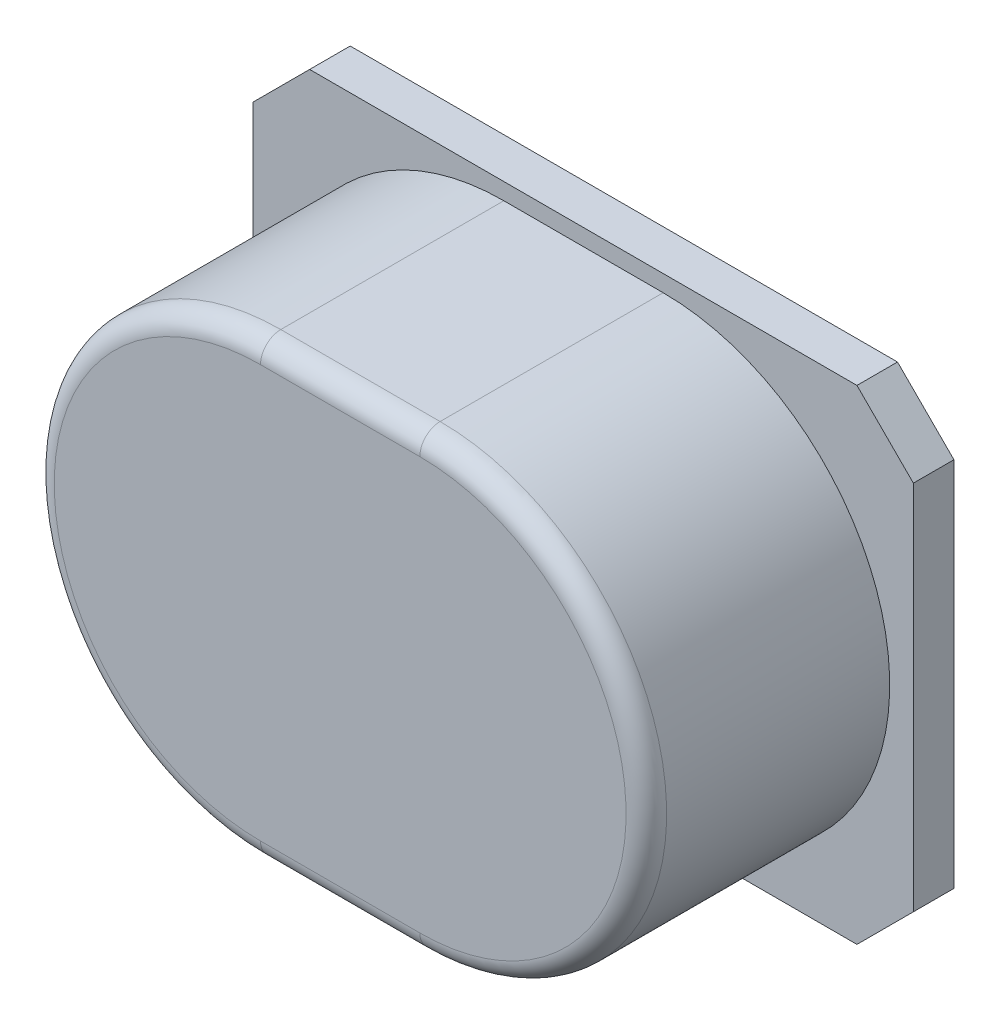
ISO-10303-21;
HEADER;
FILE_DESCRIPTION(('STEP AP214'),'2;1');
FILE_NAME('part.step','',(''),(''),'','','');
FILE_SCHEMA(('AUTOMOTIVE_DESIGN { 1 0 10303 214 1 1 1 1 }'));
ENDSEC;
DATA;
#1=APPLICATION_CONTEXT('core data for automotive mechanical design processes');
#2=APPLICATION_PROTOCOL_DEFINITION('international standard','automotive_design',2000,#1);
#3=PRODUCT_CONTEXT('',#1,'mechanical');
#4=PRODUCT('Part','Part','',(#3));
#5=PRODUCT_RELATED_PRODUCT_CATEGORY('part','',(#4));
#6=PRODUCT_DEFINITION_FORMATION('','',#4);
#7=PRODUCT_DEFINITION_CONTEXT('part definition',#1,'design');
#8=PRODUCT_DEFINITION('design','',#6,#7);
#9=PRODUCT_DEFINITION_SHAPE('','',#8);
#10=(LENGTH_UNIT() NAMED_UNIT(*) SI_UNIT(.MILLI.,.METRE.));
#11=(NAMED_UNIT(*) PLANE_ANGLE_UNIT() SI_UNIT($,.RADIAN.));
#12=(NAMED_UNIT(*) SI_UNIT($,.STERADIAN.) SOLID_ANGLE_UNIT());
#13=UNCERTAINTY_MEASURE_WITH_UNIT(LENGTH_MEASURE(1.E-05),#10,'distance_accuracy_value','');
#14=(GEOMETRIC_REPRESENTATION_CONTEXT(3) GLOBAL_UNCERTAINTY_ASSIGNED_CONTEXT((#13)) GLOBAL_UNIT_ASSIGNED_CONTEXT((#10,
#11,#12)) REPRESENTATION_CONTEXT('',''));
#15=CARTESIAN_POINT('',(0.,0.,0.));
#16=DIRECTION('',(0.,0.,1.));
#17=DIRECTION('',(1.,0.,0.));
#18=AXIS2_PLACEMENT_3D('',#15,#16,#17);
#19=CARTESIAN_POINT('',(-0.001020311839861,0.005477000000145,0.));
#20=DIRECTION('',(0.,0.,1.));
#21=DIRECTION('',(1.,0.,0.));
#22=AXIS2_PLACEMENT_3D('',#19,#20,#21);
#23=PLANE('',#22);
#24=DIRECTION('',(0.,-1.,0.));
#25=VECTOR('',#24,1.);
#26=CARTESIAN_POINT('',(-1.628729827203,0.92089,0.));
#27=LINE('',#26,#25);
#28=CARTESIAN_POINT('',(-1.628729827203,0.92089,0.));
#29=VERTEX_POINT('',#28);
#30=CARTESIAN_POINT('',(-1.628729827203,-0.909936,0.));
#31=VERTEX_POINT('',#30);
#32=EDGE_CURVE('E247',#29,#31,#27,.T.);
#33=ORIENTED_EDGE('',*,*,#32,.F.);
#34=DIRECTION('',(-0.707106781186048,-0.707106781187048,0.));
#35=VECTOR('',#34,1.);
#36=CARTESIAN_POINT('',(-1.350488827203,1.199131,0.));
#37=LINE('',#36,#35);
#38=CARTESIAN_POINT('',(-1.350488827203,1.199131,0.));
#39=VERTEX_POINT('',#38);
#40=EDGE_CURVE('E261',#39,#29,#37,.T.);
#41=ORIENTED_EDGE('',*,*,#40,.F.);
#42=DIRECTION('',(-1.,0.,0.));
#43=VECTOR('',#42,1.);
#44=CARTESIAN_POINT('',(1.348448203523,1.199131,0.));
#45=LINE('',#44,#43);
#46=CARTESIAN_POINT('',(1.348448203523,1.199131,0.));
#47=VERTEX_POINT('',#46);
#48=EDGE_CURVE('E215',#47,#39,#45,.T.);
#49=ORIENTED_EDGE('',*,*,#48,.F.);
#50=DIRECTION('',(-0.707106781186048,0.707106781187048,0.));
#51=VECTOR('',#50,1.);
#52=CARTESIAN_POINT('',(1.626689203523,0.92089,0.));
#53=LINE('',#52,#51);
#54=CARTESIAN_POINT('',(1.626689203523,0.92089,0.));
#55=VERTEX_POINT('',#54);
#56=EDGE_CURVE('E193',#55,#47,#53,.T.);
#57=ORIENTED_EDGE('',*,*,#56,.F.);
#58=DIRECTION('',(0.,1.,0.));
#59=VECTOR('',#58,1.);
#60=CARTESIAN_POINT('',(1.626689203523,-0.909936,0.));
#61=LINE('',#60,#59);
#62=CARTESIAN_POINT('',(1.626689203523,-0.909936,0.));
#63=VERTEX_POINT('',#62);
#64=EDGE_CURVE('E11',#63,#55,#61,.T.);
#65=ORIENTED_EDGE('',*,*,#64,.F.);
#66=DIRECTION('',(0.707106781186548,0.707106781186548,0.));
#67=VECTOR('',#66,1.);
#68=CARTESIAN_POINT('',(1.348448203523,-1.188177,0.));
#69=LINE('',#68,#67);
#70=CARTESIAN_POINT('',(1.348448203523,-1.188177,0.));
#71=VERTEX_POINT('',#70);
#72=EDGE_CURVE('E252',#71,#63,#69,.T.);
#73=ORIENTED_EDGE('',*,*,#72,.F.);
#74=DIRECTION('',(1.,0.,0.));
#75=VECTOR('',#74,1.);
#76=CARTESIAN_POINT('',(-1.350488827203,-1.188177,0.));
#77=LINE('',#76,#75);
#78=CARTESIAN_POINT('',(-1.350488827203,-1.188177,0.));
#79=VERTEX_POINT('',#78);
#80=EDGE_CURVE('E224',#79,#71,#77,.T.);
#81=ORIENTED_EDGE('',*,*,#80,.F.);
#82=DIRECTION('',(0.707106781186548,-0.707106781186548,0.));
#83=VECTOR('',#82,1.);
#84=CARTESIAN_POINT('',(-1.628729827203,-0.909936,0.));
#85=LINE('',#84,#83);
#86=EDGE_CURVE('E156',#31,#79,#85,.T.);
#87=ORIENTED_EDGE('',*,*,#86,.F.);
#88=EDGE_LOOP('',(#33,#41,#49,#57,#65,#73,#81,#87));
#89=FACE_BOUND('',#88,.T.);
#90=ADVANCED_FACE('F17',(#89),#23,.F.);
#91=CARTESIAN_POINT('',(0.392834,0.,1.3));
#92=DIRECTION('',(0.,0.,1.));
#93=DIRECTION('',(0.,-1.,0.));
#94=AXIS2_PLACEMENT_3D('',#91,#92,#93);
#95=TOROIDAL_SURFACE('',#94,1.017103,0.1);
#96=CARTESIAN_POINT('',(0.392834,-1.017103,1.3));
#97=DIRECTION('',(-1.,0.,0.));
#98=DIRECTION('',(0.,-1.,0.));
#99=AXIS2_PLACEMENT_3D('',#96,#97,#98);
#100=CIRCLE('',#99,0.1);
#101=CARTESIAN_POINT('',(0.392834,-1.117103,1.3));
#102=VERTEX_POINT('',#101);
#103=CARTESIAN_POINT('',(0.392834,-1.017103,1.4));
#104=VERTEX_POINT('',#103);
#105=EDGE_CURVE('E243',#102,#104,#100,.T.);
#106=ORIENTED_EDGE('',*,*,#105,.F.);
#107=CARTESIAN_POINT('',(0.392834,0.,1.3));
#108=DIRECTION('',(0.,0.,1.));
#109=DIRECTION('',(0.,-1.,0.));
#110=AXIS2_PLACEMENT_3D('',#107,#108,#109);
#111=CIRCLE('',#110,1.117103);
#112=CARTESIAN_POINT('',(0.392834,1.117103,1.3));
#113=VERTEX_POINT('',#112);
#114=EDGE_CURVE('E230',#102,#113,#111,.T.);
#115=ORIENTED_EDGE('',*,*,#114,.T.);
#116=CARTESIAN_POINT('',(0.392834,1.017103,1.3));
#117=DIRECTION('',(1.,0.,0.));
#118=DIRECTION('',(0.,1.,0.));
#119=AXIS2_PLACEMENT_3D('',#116,#117,#118);
#120=CIRCLE('',#119,0.1);
#121=CARTESIAN_POINT('',(0.392834,1.017103,1.4));
#122=VERTEX_POINT('',#121);
#123=EDGE_CURVE('E206',#113,#122,#120,.T.);
#124=ORIENTED_EDGE('',*,*,#123,.T.);
#125=CARTESIAN_POINT('',(0.392834,0.,1.4));
#126=DIRECTION('',(0.,0.,1.));
#127=DIRECTION('',(0.,-1.,0.));
#128=AXIS2_PLACEMENT_3D('',#125,#126,#127);
#129=CIRCLE('',#128,1.017103);
#130=EDGE_CURVE('E240',#104,#122,#129,.T.);
#131=ORIENTED_EDGE('',*,*,#130,.F.);
#132=EDGE_LOOP('',(#106,#115,#124,#131));
#133=FACE_BOUND('',#132,.T.);
#134=ADVANCED_FACE('F307',(#133),#95,.T.);
#135=CARTESIAN_POINT('',(1.626689203523,-0.909936,0.));
#136=DIRECTION('',(-1.,0.,0.));
#137=DIRECTION('',(0.,0.,1.));
#138=AXIS2_PLACEMENT_3D('',#135,#136,#137);
#139=PLANE('',#138);
#140=DIRECTION('',(0.,0.,1.));
#141=VECTOR('',#140,1.);
#142=CARTESIAN_POINT('',(1.626689203523,-0.909936,0.));
#143=LINE('',#142,#141);
#144=CARTESIAN_POINT('',(1.626689203523,-0.909936,0.2));
#145=VERTEX_POINT('',#144);
#146=EDGE_CURVE('E20',#63,#145,#143,.T.);
#147=ORIENTED_EDGE('',*,*,#146,.F.);
#148=ORIENTED_EDGE('',*,*,#64,.T.);
#149=DIRECTION('',(0.,0.,1.));
#150=VECTOR('',#149,1.);
#151=CARTESIAN_POINT('',(1.626689203523,0.92089,0.));
#152=LINE('',#151,#150);
#153=CARTESIAN_POINT('',(1.626689203523,0.92089,0.2));
#154=VERTEX_POINT('',#153);
#155=EDGE_CURVE('E190',#55,#154,#152,.T.);
#156=ORIENTED_EDGE('',*,*,#155,.T.);
#157=DIRECTION('',(0.,1.,0.));
#158=VECTOR('',#157,1.);
#159=CARTESIAN_POINT('',(1.626689203523,-0.909936,0.2));
#160=LINE('',#159,#158);
#161=EDGE_CURVE('E186',#145,#154,#160,.T.);
#162=ORIENTED_EDGE('',*,*,#161,.F.);
#163=EDGE_LOOP('',(#147,#148,#156,#162));
#164=FACE_BOUND('',#163,.T.);
#165=ADVANCED_FACE('F286',(#164),#139,.F.);
#166=CARTESIAN_POINT('',(1.348448203523,-1.188177,0.));
#167=DIRECTION('',(-0.707106781186548,0.707106781186548,0.));
#168=DIRECTION('',(0.,0.,1.));
#169=AXIS2_PLACEMENT_3D('',#166,#167,#168);
#170=PLANE('',#169);
#171=DIRECTION('',(0.,0.,1.));
#172=VECTOR('',#171,1.);
#173=CARTESIAN_POINT('',(1.348448203523,-1.188177,0.));
#174=LINE('',#173,#172);
#175=CARTESIAN_POINT('',(1.348448203523,-1.188177,0.2));
#176=VERTEX_POINT('',#175);
#177=EDGE_CURVE('E166',#71,#176,#174,.T.);
#178=ORIENTED_EDGE('',*,*,#177,.F.);
#179=ORIENTED_EDGE('',*,*,#72,.T.);
#180=ORIENTED_EDGE('',*,*,#146,.T.);
#181=DIRECTION('',(0.707106781186548,0.707106781186548,0.));
#182=VECTOR('',#181,1.);
#183=CARTESIAN_POINT('',(1.348448203523,-1.188177,0.2));
#184=LINE('',#183,#182);
#185=EDGE_CURVE('E171',#176,#145,#184,.T.);
#186=ORIENTED_EDGE('',*,*,#185,.F.);
#187=EDGE_LOOP('',(#178,#179,#180,#186));
#188=FACE_BOUND('',#187,.T.);
#189=ADVANCED_FACE('F288',(#188),#170,.F.);
#190=CARTESIAN_POINT('',(1.626689203523,0.92089,0.));
#191=DIRECTION('',(-0.707106781187048,-0.707106781186048,0.));
#192=DIRECTION('',(-0.707106781186048,0.707106781187048,0.));
#193=AXIS2_PLACEMENT_3D('',#190,#191,#192);
#194=PLANE('',#193);
#195=ORIENTED_EDGE('',*,*,#155,.F.);
#196=ORIENTED_EDGE('',*,*,#56,.T.);
#197=DIRECTION('',(0.,0.,1.));
#198=VECTOR('',#197,1.);
#199=CARTESIAN_POINT('',(1.348448203523,1.199131,0.));
#200=LINE('',#199,#198);
#201=CARTESIAN_POINT('',(1.348448203523,1.199131,0.2));
#202=VERTEX_POINT('',#201);
#203=EDGE_CURVE('E160',#47,#202,#200,.T.);
#204=ORIENTED_EDGE('',*,*,#203,.T.);
#205=DIRECTION('',(-0.707106781186048,0.707106781187048,0.));
#206=VECTOR('',#205,1.);
#207=CARTESIAN_POINT('',(1.626689203523,0.92089,0.2));
#208=LINE('',#207,#206);
#209=EDGE_CURVE('E189',#154,#202,#208,.T.);
#210=ORIENTED_EDGE('',*,*,#209,.F.);
#211=EDGE_LOOP('',(#195,#196,#204,#210));
#212=FACE_BOUND('',#211,.T.);
#213=ADVANCED_FACE('F275',(#212),#194,.F.);
#214=CARTESIAN_POINT('',(-1.350488827203,-1.188177,0.));
#215=DIRECTION('',(0.,1.,0.));
#216=DIRECTION('',(1.,0.,0.));
#217=AXIS2_PLACEMENT_3D('',#214,#215,#216);
#218=PLANE('',#217);
#219=DIRECTION('',(0.,0.,1.));
#220=VECTOR('',#219,1.);
#221=CARTESIAN_POINT('',(-1.350488827203,-1.188177,0.));
#222=LINE('',#221,#220);
#223=CARTESIAN_POINT('',(-1.350488827203,-1.188177,0.2));
#224=VERTEX_POINT('',#223);
#225=EDGE_CURVE('E149',#79,#224,#222,.T.);
#226=ORIENTED_EDGE('',*,*,#225,.F.);
#227=ORIENTED_EDGE('',*,*,#80,.T.);
#228=ORIENTED_EDGE('',*,*,#177,.T.);
#229=DIRECTION('',(1.,0.,0.));
#230=VECTOR('',#229,1.);
#231=CARTESIAN_POINT('',(-1.350488827203,-1.188177,0.2));
#232=LINE('',#231,#230);
#233=EDGE_CURVE('E163',#224,#176,#232,.T.);
#234=ORIENTED_EDGE('',*,*,#233,.F.);
#235=EDGE_LOOP('',(#226,#227,#228,#234));
#236=FACE_BOUND('',#235,.T.);
#237=ADVANCED_FACE('F164',(#236),#218,.F.);
#238=CARTESIAN_POINT('',(1.348448203523,1.199131,0.));
#239=DIRECTION('',(0.,-1.,0.));
#240=DIRECTION('',(0.,0.,-1.));
#241=AXIS2_PLACEMENT_3D('',#238,#239,#240);
#242=PLANE('',#241);
#243=ORIENTED_EDGE('',*,*,#203,.F.);
#244=ORIENTED_EDGE('',*,*,#48,.T.);
#245=DIRECTION('',(0.,0.,1.));
#246=VECTOR('',#245,1.);
#247=CARTESIAN_POINT('',(-1.350488827203,1.199131,0.));
#248=LINE('',#247,#246);
#249=CARTESIAN_POINT('',(-1.350488827203,1.199131,0.2));
#250=VERTEX_POINT('',#249);
#251=EDGE_CURVE('E258',#39,#250,#248,.T.);
#252=ORIENTED_EDGE('',*,*,#251,.T.);
#253=DIRECTION('',(-1.,0.,0.));
#254=VECTOR('',#253,1.);
#255=CARTESIAN_POINT('',(1.348448203523,1.199131,0.2));
#256=LINE('',#255,#254);
#257=EDGE_CURVE('E197',#202,#250,#256,.T.);
#258=ORIENTED_EDGE('',*,*,#257,.F.);
#259=EDGE_LOOP('',(#243,#244,#252,#258));
#260=FACE_BOUND('',#259,.T.);
#261=ADVANCED_FACE('F283',(#260),#242,.F.);
#262=CARTESIAN_POINT('',(-1.628729827203,-0.909936,0.));
#263=DIRECTION('',(0.707106781186548,0.707106781186548,0.));
#264=DIRECTION('',(0.,0.,-1.));
#265=AXIS2_PLACEMENT_3D('',#262,#263,#264);
#266=PLANE('',#265);
#267=DIRECTION('',(0.,0.,1.));
#268=VECTOR('',#267,1.);
#269=CARTESIAN_POINT('',(-1.628729827203,-0.909936,0.));
#270=LINE('',#269,#268);
#271=CARTESIAN_POINT('',(-1.628729827203,-0.909936,0.2));
#272=VERTEX_POINT('',#271);
#273=EDGE_CURVE('E250',#31,#272,#270,.T.);
#274=ORIENTED_EDGE('',*,*,#273,.F.);
#275=ORIENTED_EDGE('',*,*,#86,.T.);
#276=ORIENTED_EDGE('',*,*,#225,.T.);
#277=DIRECTION('',(0.707106781186548,-0.707106781186548,0.));
#278=VECTOR('',#277,1.);
#279=CARTESIAN_POINT('',(-1.628729827203,-0.909936,0.2));
#280=LINE('',#279,#278);
#281=EDGE_CURVE('E154',#272,#224,#280,.T.);
#282=ORIENTED_EDGE('',*,*,#281,.F.);
#283=EDGE_LOOP('',(#274,#275,#276,#282));
#284=FACE_BOUND('',#283,.T.);
#285=ADVANCED_FACE('F152',(#284),#266,.F.);
#286=CARTESIAN_POINT('',(-1.350488827203,1.199131,0.));
#287=DIRECTION('',(0.707106781187048,-0.707106781186048,0.));
#288=DIRECTION('',(0.,0.,-1.));
#289=AXIS2_PLACEMENT_3D('',#286,#287,#288);
#290=PLANE('',#289);
#291=ORIENTED_EDGE('',*,*,#251,.F.);
#292=ORIENTED_EDGE('',*,*,#40,.T.);
#293=DIRECTION('',(0.,0.,1.));
#294=VECTOR('',#293,1.);
#295=CARTESIAN_POINT('',(-1.628729827203,0.92089,0.));
#296=LINE('',#295,#294);
#297=CARTESIAN_POINT('',(-1.628729827203,0.92089,0.2));
#298=VERTEX_POINT('',#297);
#299=EDGE_CURVE('E244',#29,#298,#296,.T.);
#300=ORIENTED_EDGE('',*,*,#299,.T.);
#301=DIRECTION('',(-0.707106781186048,-0.707106781187048,0.));
#302=VECTOR('',#301,1.);
#303=CARTESIAN_POINT('',(-1.350488827203,1.199131,0.2));
#304=LINE('',#303,#302);
#305=EDGE_CURVE('E201',#250,#298,#304,.T.);
#306=ORIENTED_EDGE('',*,*,#305,.F.);
#307=EDGE_LOOP('',(#291,#292,#300,#306));
#308=FACE_BOUND('',#307,.T.);
#309=ADVANCED_FACE('F293',(#308),#290,.F.);
#310=CARTESIAN_POINT('',(-1.628729827203,0.92089,0.));
#311=DIRECTION('',(1.,0.,0.));
#312=DIRECTION('',(0.,1.,0.));
#313=AXIS2_PLACEMENT_3D('',#310,#311,#312);
#314=PLANE('',#313);
#315=ORIENTED_EDGE('',*,*,#299,.F.);
#316=ORIENTED_EDGE('',*,*,#32,.T.);
#317=ORIENTED_EDGE('',*,*,#273,.T.);
#318=DIRECTION('',(0.,-1.,0.));
#319=VECTOR('',#318,1.);
#320=CARTESIAN_POINT('',(-1.628729827203,0.92089,0.2));
#321=LINE('',#320,#319);
#322=EDGE_CURVE('E176',#298,#272,#321,.T.);
#323=ORIENTED_EDGE('',*,*,#322,.F.);
#324=EDGE_LOOP('',(#315,#316,#317,#323));
#325=FACE_BOUND('',#324,.T.);
#326=ADVANCED_FACE('F291',(#325),#314,.F.);
#327=CARTESIAN_POINT('',(-0.392834,-1.017103,1.3));
#328=DIRECTION('',(1.,0.,0.));
#329=DIRECTION('',(0.,-1.,0.));
#330=AXIS2_PLACEMENT_3D('',#327,#328,#329);
#331=CYLINDRICAL_SURFACE('',#330,0.1);
#332=CARTESIAN_POINT('',(-0.392834,-1.017103,1.3));
#333=DIRECTION('',(-1.,0.,0.));
#334=DIRECTION('',(0.,-1.,0.));
#335=AXIS2_PLACEMENT_3D('',#332,#333,#334);
#336=CIRCLE('',#335,0.1);
#337=CARTESIAN_POINT('',(-0.392834,-1.117103,1.3));
#338=VERTEX_POINT('',#337);
#339=CARTESIAN_POINT('',(-0.392834,-1.017103,1.4));
#340=VERTEX_POINT('',#339);
#341=EDGE_CURVE('E326',#338,#340,#336,.T.);
#342=ORIENTED_EDGE('',*,*,#341,.F.);
#343=DIRECTION('',(1.,0.,0.));
#344=VECTOR('',#343,1.);
#345=CARTESIAN_POINT('',(-0.392834,-1.117103,1.3));
#346=LINE('',#345,#344);
#347=EDGE_CURVE('E223',#338,#102,#346,.T.);
#348=ORIENTED_EDGE('',*,*,#347,.T.);
#349=ORIENTED_EDGE('',*,*,#105,.T.);
#350=DIRECTION('',(1.,0.,0.));
#351=VECTOR('',#350,1.);
#352=CARTESIAN_POINT('',(-0.392834,-1.017103,1.4));
#353=LINE('',#352,#351);
#354=EDGE_CURVE('E205',#340,#104,#353,.T.);
#355=ORIENTED_EDGE('',*,*,#354,.F.);
#356=EDGE_LOOP('',(#342,#348,#349,#355));
#357=FACE_BOUND('',#356,.T.);
#358=ADVANCED_FACE('F301',(#357),#331,.T.);
#359=CARTESIAN_POINT('',(0.,0.,1.4));
#360=DIRECTION('',(0.,0.,1.));
#361=DIRECTION('',(1.,0.,0.));
#362=AXIS2_PLACEMENT_3D('',#359,#360,#361);
#363=PLANE('',#362);
#364=ORIENTED_EDGE('',*,*,#354,.T.);
#365=ORIENTED_EDGE('',*,*,#130,.T.);
#366=DIRECTION('',(-1.,0.,0.));
#367=VECTOR('',#366,1.);
#368=CARTESIAN_POINT('',(0.392834,1.017103,1.4));
#369=LINE('',#368,#367);
#370=CARTESIAN_POINT('',(-0.392834,1.017103,1.4));
#371=VERTEX_POINT('',#370);
#372=EDGE_CURVE('E202',#122,#371,#369,.T.);
#373=ORIENTED_EDGE('',*,*,#372,.T.);
#374=CARTESIAN_POINT('',(-0.392834,0.,1.4));
#375=DIRECTION('',(0.,0.,1.));
#376=DIRECTION('',(0.,1.,0.));
#377=AXIS2_PLACEMENT_3D('',#374,#375,#376);
#378=CIRCLE('',#377,1.017103);
#379=EDGE_CURVE('E182',#371,#340,#378,.T.);
#380=ORIENTED_EDGE('',*,*,#379,.T.);
#381=EDGE_LOOP('',(#364,#365,#373,#380));
#382=FACE_BOUND('',#381,.T.);
#383=ADVANCED_FACE('F317',(#382),#363,.T.);
#384=CARTESIAN_POINT('',(0.392834,1.017103,1.3));
#385=DIRECTION('',(-1.,0.,0.));
#386=DIRECTION('',(0.,1.,0.));
#387=AXIS2_PLACEMENT_3D('',#384,#385,#386);
#388=CYLINDRICAL_SURFACE('',#387,0.1);
#389=ORIENTED_EDGE('',*,*,#123,.F.);
#390=DIRECTION('',(-1.,0.,0.));
#391=VECTOR('',#390,1.);
#392=CARTESIAN_POINT('',(0.392834,1.117103,1.3));
#393=LINE('',#392,#391);
#394=CARTESIAN_POINT('',(-0.392834,1.117103,1.3));
#395=VERTEX_POINT('',#394);
#396=EDGE_CURVE('E365',#113,#395,#393,.T.);
#397=ORIENTED_EDGE('',*,*,#396,.T.);
#398=CARTESIAN_POINT('',(-0.392834,1.017103,1.3));
#399=DIRECTION('',(1.,0.,0.));
#400=DIRECTION('',(0.,1.,0.));
#401=AXIS2_PLACEMENT_3D('',#398,#399,#400);
#402=CIRCLE('',#401,0.1);
#403=EDGE_CURVE('E332',#395,#371,#402,.T.);
#404=ORIENTED_EDGE('',*,*,#403,.T.);
#405=ORIENTED_EDGE('',*,*,#372,.F.);
#406=EDGE_LOOP('',(#389,#397,#404,#405));
#407=FACE_BOUND('',#406,.T.);
#408=ADVANCED_FACE('F322',(#407),#388,.T.);
#409=CARTESIAN_POINT('',(0.392834,0.,0.2));
#410=DIRECTION('',(0.,0.,-1.));
#411=DIRECTION('',(1.,0.,0.));
#412=AXIS2_PLACEMENT_3D('',#409,#410,#411);
#413=CYLINDRICAL_SURFACE('',#412,1.117103);
#414=DIRECTION('',(0.,0.,1.));
#415=VECTOR('',#414,1.);
#416=CARTESIAN_POINT('',(0.392834,-1.117103,0.2));
#417=LINE('',#416,#415);
#418=CARTESIAN_POINT('',(0.392834,-1.117103,0.2));
#419=VERTEX_POINT('',#418);
#420=EDGE_CURVE('E219',#419,#102,#417,.T.);
#421=ORIENTED_EDGE('',*,*,#420,.F.);
#422=CARTESIAN_POINT('',(0.392834,0.,0.2));
#423=DIRECTION('',(0.,0.,1.));
#424=DIRECTION('',(1.,0.,0.));
#425=AXIS2_PLACEMENT_3D('',#422,#423,#424);
#426=CIRCLE('',#425,1.117103);
#427=CARTESIAN_POINT('',(0.392834,1.117103,0.2));
#428=VERTEX_POINT('',#427);
#429=EDGE_CURVE('E209',#419,#428,#426,.T.);
#430=ORIENTED_EDGE('',*,*,#429,.T.);
#431=DIRECTION('',(0.,0.,1.));
#432=VECTOR('',#431,1.);
#433=CARTESIAN_POINT('',(0.392834,1.117103,0.2));
#434=LINE('',#433,#432);
#435=EDGE_CURVE('E344',#428,#113,#434,.T.);
#436=ORIENTED_EDGE('',*,*,#435,.T.);
#437=ORIENTED_EDGE('',*,*,#114,.F.);
#438=EDGE_LOOP('',(#421,#430,#436,#437));
#439=FACE_BOUND('',#438,.T.);
#440=ADVANCED_FACE('F383',(#439),#413,.T.);
#441=CARTESIAN_POINT('',(-0.392834,-1.117103,0.2));
#442=DIRECTION('',(0.,1.,0.));
#443=DIRECTION('',(1.,0.,0.));
#444=AXIS2_PLACEMENT_3D('',#441,#442,#443);
#445=PLANE('',#444);
#446=DIRECTION('',(0.,0.,1.));
#447=VECTOR('',#446,1.);
#448=CARTESIAN_POINT('',(-0.392834,-1.117103,0.2));
#449=LINE('',#448,#447);
#450=CARTESIAN_POINT('',(-0.392834,-1.117103,0.2));
#451=VERTEX_POINT('',#450);
#452=EDGE_CURVE('E345',#451,#338,#449,.T.);
#453=ORIENTED_EDGE('',*,*,#452,.F.);
#454=DIRECTION('',(1.,0.,0.));
#455=VECTOR('',#454,1.);
#456=CARTESIAN_POINT('',(-0.392834,-1.117103,0.2));
#457=LINE('',#456,#455);
#458=EDGE_CURVE('E212',#451,#419,#457,.T.);
#459=ORIENTED_EDGE('',*,*,#458,.T.);
#460=ORIENTED_EDGE('',*,*,#420,.T.);
#461=ORIENTED_EDGE('',*,*,#347,.F.);
#462=EDGE_LOOP('',(#453,#459,#460,#461));
#463=FACE_BOUND('',#462,.T.);
#464=ADVANCED_FACE('F398',(#463),#445,.F.);
#465=CARTESIAN_POINT('',(-0.001020311839861,0.005477000000145,0.2));
#466=DIRECTION('',(0.,0.,1.));
#467=DIRECTION('',(1.,0.,0.));
#468=AXIS2_PLACEMENT_3D('',#465,#466,#467);
#469=PLANE('',#468);
#470=CARTESIAN_POINT('',(-0.392834,0.,0.2));
#471=DIRECTION('',(0.,0.,1.));
#472=DIRECTION('',(1.,0.,0.));
#473=AXIS2_PLACEMENT_3D('',#470,#471,#472);
#474=CIRCLE('',#473,1.117103);
#475=CARTESIAN_POINT('',(-0.392834,1.117103,0.2));
#476=VERTEX_POINT('',#475);
#477=EDGE_CURVE('E351',#476,#451,#474,.T.);
#478=ORIENTED_EDGE('',*,*,#477,.F.);
#479=DIRECTION('',(-1.,0.,0.));
#480=VECTOR('',#479,1.);
#481=CARTESIAN_POINT('',(0.392834,1.117103,0.2));
#482=LINE('',#481,#480);
#483=EDGE_CURVE('E362',#428,#476,#482,.T.);
#484=ORIENTED_EDGE('',*,*,#483,.F.);
#485=ORIENTED_EDGE('',*,*,#429,.F.);
#486=ORIENTED_EDGE('',*,*,#458,.F.);
#487=EDGE_LOOP('',(#478,#484,#485,#486));
#488=FACE_BOUND('',#487,.T.);
#489=ORIENTED_EDGE('',*,*,#322,.T.);
#490=ORIENTED_EDGE('',*,*,#281,.T.);
#491=ORIENTED_EDGE('',*,*,#233,.T.);
#492=ORIENTED_EDGE('',*,*,#185,.T.);
#493=ORIENTED_EDGE('',*,*,#161,.T.);
#494=ORIENTED_EDGE('',*,*,#209,.T.);
#495=ORIENTED_EDGE('',*,*,#257,.T.);
#496=ORIENTED_EDGE('',*,*,#305,.T.);
#497=EDGE_LOOP('',(#489,#490,#491,#492,#493,#494,#495,#496));
#498=FACE_BOUND('',#497,.T.);
#499=ADVANCED_FACE('F173',(#488,#498),#469,.T.);
#500=CARTESIAN_POINT('',(-0.392834,0.,1.3));
#501=DIRECTION('',(0.,0.,1.));
#502=DIRECTION('',(0.,1.,0.));
#503=AXIS2_PLACEMENT_3D('',#500,#501,#502);
#504=TOROIDAL_SURFACE('',#503,1.017103,0.1);
#505=ORIENTED_EDGE('',*,*,#403,.F.);
#506=CARTESIAN_POINT('',(-0.392834,0.,1.3));
#507=DIRECTION('',(0.,0.,1.));
#508=DIRECTION('',(0.,1.,0.));
#509=AXIS2_PLACEMENT_3D('',#506,#507,#508);
#510=CIRCLE('',#509,1.117103);
#511=EDGE_CURVE('E335',#395,#338,#510,.T.);
#512=ORIENTED_EDGE('',*,*,#511,.T.);
#513=ORIENTED_EDGE('',*,*,#341,.T.);
#514=ORIENTED_EDGE('',*,*,#379,.F.);
#515=EDGE_LOOP('',(#505,#512,#513,#514));
#516=FACE_BOUND('',#515,.T.);
#517=ADVANCED_FACE('F337',(#516),#504,.T.);
#518=CARTESIAN_POINT('',(0.392834,1.117103,0.2));
#519=DIRECTION('',(0.,-1.,0.));
#520=DIRECTION('',(0.,0.,-1.));
#521=AXIS2_PLACEMENT_3D('',#518,#519,#520);
#522=PLANE('',#521);
#523=ORIENTED_EDGE('',*,*,#435,.F.);
#524=ORIENTED_EDGE('',*,*,#483,.T.);
#525=DIRECTION('',(0.,0.,1.));
#526=VECTOR('',#525,1.);
#527=CARTESIAN_POINT('',(-0.392834,1.117103,0.2));
#528=LINE('',#527,#526);
#529=EDGE_CURVE('E358',#476,#395,#528,.T.);
#530=ORIENTED_EDGE('',*,*,#529,.T.);
#531=ORIENTED_EDGE('',*,*,#396,.F.);
#532=EDGE_LOOP('',(#523,#524,#530,#531));
#533=FACE_BOUND('',#532,.T.);
#534=ADVANCED_FACE('F381',(#533),#522,.F.);
#535=CARTESIAN_POINT('',(-0.392834,0.,0.2));
#536=DIRECTION('',(0.,0.,-1.));
#537=DIRECTION('',(-1.,0.,0.));
#538=AXIS2_PLACEMENT_3D('',#535,#536,#537);
#539=CYLINDRICAL_SURFACE('',#538,1.117103);
#540=ORIENTED_EDGE('',*,*,#529,.F.);
#541=ORIENTED_EDGE('',*,*,#477,.T.);
#542=ORIENTED_EDGE('',*,*,#452,.T.);
#543=ORIENTED_EDGE('',*,*,#511,.F.);
#544=EDGE_LOOP('',(#540,#541,#542,#543));
#545=FACE_BOUND('',#544,.T.);
#546=ADVANCED_FACE('F349',(#545),#539,.T.);
#547=CLOSED_SHELL('',(#90,#134,#165,#189,#213,#237,#261,#285,#309,#326,#358,#383,#408,#440,#464,
#499,#517,#534,#546));
#548=MANIFOLD_SOLID_BREP('B1',#547);
#549=ADVANCED_BREP_SHAPE_REPRESENTATION('',(#18,#548),#14);
#550=SHAPE_DEFINITION_REPRESENTATION(#9,#549);
ENDSEC;
END-ISO-10303-21;
